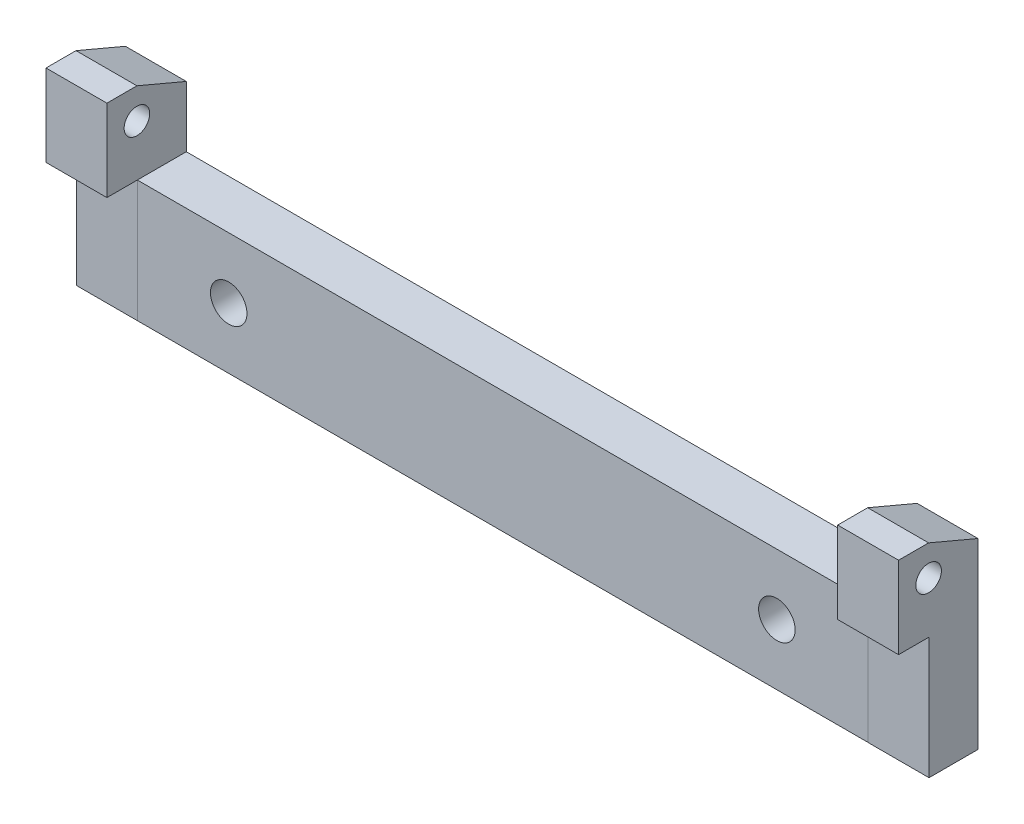
ISO-10303-21;
HEADER;
FILE_DESCRIPTION(('STEP AP214'),'2;1');
FILE_NAME('part.step','',(''),(''),'','','');
FILE_SCHEMA(('AUTOMOTIVE_DESIGN { 1 0 10303 214 1 1 1 1 }'));
ENDSEC;
DATA;
#1=APPLICATION_CONTEXT('core data for automotive mechanical design processes');
#2=APPLICATION_PROTOCOL_DEFINITION('international standard','automotive_design',2000,#1);
#3=PRODUCT_CONTEXT('',#1,'mechanical');
#4=PRODUCT('Part','Part','',(#3));
#5=PRODUCT_RELATED_PRODUCT_CATEGORY('part','',(#4));
#6=PRODUCT_DEFINITION_FORMATION('','',#4);
#7=PRODUCT_DEFINITION_CONTEXT('part definition',#1,'design');
#8=PRODUCT_DEFINITION('design','',#6,#7);
#9=PRODUCT_DEFINITION_SHAPE('','',#8);
#10=(LENGTH_UNIT() NAMED_UNIT(*) SI_UNIT(.MILLI.,.METRE.));
#11=(NAMED_UNIT(*) PLANE_ANGLE_UNIT() SI_UNIT($,.RADIAN.));
#12=(NAMED_UNIT(*) SI_UNIT($,.STERADIAN.) SOLID_ANGLE_UNIT());
#13=UNCERTAINTY_MEASURE_WITH_UNIT(LENGTH_MEASURE(1.E-05),#10,'distance_accuracy_value','');
#14=(GEOMETRIC_REPRESENTATION_CONTEXT(3) GLOBAL_UNCERTAINTY_ASSIGNED_CONTEXT((#13)) GLOBAL_UNIT_ASSIGNED_CONTEXT((#10,
#11,#12)) REPRESENTATION_CONTEXT('',''));
#15=CARTESIAN_POINT('',(0.,0.,0.));
#16=DIRECTION('',(0.,0.,1.));
#17=DIRECTION('',(1.,0.,0.));
#18=AXIS2_PLACEMENT_3D('',#15,#16,#17);
#19=CARTESIAN_POINT('',(120.,0.,0.));
#20=DIRECTION('',(-1.,0.,0.));
#21=DIRECTION('',(0.,0.,1.));
#22=AXIS2_PLACEMENT_3D('',#19,#20,#21);
#23=PLANE('',#22);
#24=CARTESIAN_POINT('',(120.,8.43400289856773,-27.8888815226087));
#25=DIRECTION('',(1.,0.,0.));
#26=DIRECTION('',(0.,0.,-1.));
#27=AXIS2_PLACEMENT_3D('',#24,#25,#26);
#28=CIRCLE('',#27,2.1);
#29=CARTESIAN_POINT('',(120.,8.43400289856773,-29.9888815226087));
#30=VERTEX_POINT('',#29);
#31=EDGE_CURVE('E186',#30,#30,#28,.T.);
#32=ORIENTED_EDGE('',*,*,#31,.T.);
#33=EDGE_LOOP('',(#32));
#34=FACE_BOUND('',#33,.T.);
#35=DIRECTION('',(0.,1.,0.));
#36=VECTOR('',#35,1.);
#37=CARTESIAN_POINT('',(120.,10.,-36.));
#38=LINE('',#37,#36);
#39=CARTESIAN_POINT('',(120.,0.,-36.));
#40=VERTEX_POINT('',#39);
#41=CARTESIAN_POINT('',(120.,10.,-36.));
#42=VERTEX_POINT('',#41);
#43=EDGE_CURVE('E54',#40,#42,#38,.T.);
#44=ORIENTED_EDGE('',*,*,#43,.F.);
#45=DIRECTION('',(0.,0.,1.));
#46=VECTOR('',#45,1.);
#47=CARTESIAN_POINT('',(120.,0.,-36.));
#48=LINE('',#47,#46);
#49=CARTESIAN_POINT('',(120.,0.,-27.9757067141904));
#50=VERTEX_POINT('',#49);
#51=EDGE_CURVE('E166',#40,#50,#48,.T.);
#52=ORIENTED_EDGE('',*,*,#51,.T.);
#53=DIRECTION('',(0.,1.,0.));
#54=VECTOR('',#53,1.);
#55=CARTESIAN_POINT('',(120.,-20.,-27.9757067141904));
#56=LINE('',#55,#54);
#57=CARTESIAN_POINT('',(120.,-20.,-27.9757067141904));
#58=VERTEX_POINT('',#57);
#59=EDGE_CURVE('E48',#58,#50,#56,.T.);
#60=ORIENTED_EDGE('',*,*,#59,.F.);
#61=DIRECTION('',(0.,0.,-1.));
#62=VECTOR('',#61,1.);
#63=CARTESIAN_POINT('',(120.,-20.,-36.));
#64=LINE('',#63,#62);
#65=CARTESIAN_POINT('',(120.,-20.,-27.9582577076685));
#66=VERTEX_POINT('',#65);
#67=EDGE_CURVE('E196',#66,#58,#64,.T.);
#68=ORIENTED_EDGE('',*,*,#67,.F.);
#69=DIRECTION('',(0.,-1.,0.));
#70=VECTOR('',#69,1.);
#71=CARTESIAN_POINT('',(120.,-20.,-27.9582577076685));
#72=LINE('',#71,#70);
#73=CARTESIAN_POINT('',(120.,0.,-27.9582577076685));
#74=VERTEX_POINT('',#73);
#75=EDGE_CURVE('E218',#74,#66,#72,.T.);
#76=ORIENTED_EDGE('',*,*,#75,.F.);
#77=DIRECTION('',(0.,0.,-1.));
#78=VECTOR('',#77,1.);
#79=CARTESIAN_POINT('',(120.,0.,-27.9582577076685));
#80=LINE('',#79,#78);
#81=CARTESIAN_POINT('',(120.,0.,-22.9582577076685));
#82=VERTEX_POINT('',#81);
#83=EDGE_CURVE('E216',#82,#74,#80,.T.);
#84=ORIENTED_EDGE('',*,*,#83,.F.);
#85=DIRECTION('',(0.,-1.,0.));
#86=VECTOR('',#85,1.);
#87=CARTESIAN_POINT('',(120.,0.,-22.9582577076685));
#88=LINE('',#87,#86);
#89=CARTESIAN_POINT('',(120.,13.4340028985677,-22.9582577076685));
#90=VERTEX_POINT('',#89);
#91=EDGE_CURVE('E214',#90,#82,#88,.T.);
#92=ORIENTED_EDGE('',*,*,#91,.F.);
#93=DIRECTION('',(0.,0.,1.));
#94=VECTOR('',#93,1.);
#95=CARTESIAN_POINT('',(120.,13.4340028985677,-22.9582577076685));
#96=LINE('',#95,#94);
#97=CARTESIAN_POINT('',(120.,13.4340028985677,-27.8888815226087));
#98=VERTEX_POINT('',#97);
#99=EDGE_CURVE('E212',#98,#90,#96,.T.);
#100=ORIENTED_EDGE('',*,*,#99,.F.);
#101=DIRECTION('',(0.,0.389868762606835,0.920870429508634));
#102=VECTOR('',#101,1.);
#103=CARTESIAN_POINT('',(120.,13.4340028985677,-27.8888815226087));
#104=LINE('',#103,#102);
#105=EDGE_CURVE('E210',#42,#98,#104,.T.);
#106=ORIENTED_EDGE('',*,*,#105,.F.);
#107=EDGE_LOOP('',(#44,#52,#60,#68,#76,#84,#92,#100,#106));
#108=FACE_BOUND('',#107,.T.);
#109=ADVANCED_FACE('F33',(#34,#108),#23,.T.);
#110=CARTESIAN_POINT('',(130.,0.,0.));
#111=DIRECTION('',(-1.,0.,0.));
#112=DIRECTION('',(0.,0.,1.));
#113=AXIS2_PLACEMENT_3D('',#110,#111,#112);
#114=PLANE('',#113);
#115=DIRECTION('',(0.,1.,0.));
#116=VECTOR('',#115,1.);
#117=CARTESIAN_POINT('',(130.,10.,-36.));
#118=LINE('',#117,#116);
#119=CARTESIAN_POINT('',(130.,-20.,-36.));
#120=VERTEX_POINT('',#119);
#121=CARTESIAN_POINT('',(130.,10.,-36.));
#122=VERTEX_POINT('',#121);
#123=EDGE_CURVE('E192',#120,#122,#118,.T.);
#124=ORIENTED_EDGE('',*,*,#123,.T.);
#125=DIRECTION('',(0.,0.389868762606835,0.920870429508634));
#126=VECTOR('',#125,1.);
#127=CARTESIAN_POINT('',(130.,13.4340028985677,-27.8888815226087));
#128=LINE('',#127,#126);
#129=CARTESIAN_POINT('',(130.,13.4340028985677,-27.8888815226087));
#130=VERTEX_POINT('',#129);
#131=EDGE_CURVE('E195',#122,#130,#128,.T.);
#132=ORIENTED_EDGE('',*,*,#131,.T.);
#133=DIRECTION('',(0.,0.,1.));
#134=VECTOR('',#133,1.);
#135=CARTESIAN_POINT('',(130.,13.4340028985677,-22.9582577076685));
#136=LINE('',#135,#134);
#137=CARTESIAN_POINT('',(130.,13.4340028985677,-22.9582577076685));
#138=VERTEX_POINT('',#137);
#139=EDGE_CURVE('E198',#130,#138,#136,.T.);
#140=ORIENTED_EDGE('',*,*,#139,.T.);
#141=DIRECTION('',(0.,-1.,0.));
#142=VECTOR('',#141,1.);
#143=CARTESIAN_POINT('',(130.,0.,-22.9582577076685));
#144=LINE('',#143,#142);
#145=CARTESIAN_POINT('',(130.,0.,-22.9582577076685));
#146=VERTEX_POINT('',#145);
#147=EDGE_CURVE('E200',#138,#146,#144,.T.);
#148=ORIENTED_EDGE('',*,*,#147,.T.);
#149=DIRECTION('',(0.,0.,-1.));
#150=VECTOR('',#149,1.);
#151=CARTESIAN_POINT('',(130.,0.,-27.9582577076685));
#152=LINE('',#151,#150);
#153=CARTESIAN_POINT('',(130.,0.,-27.9582577076685));
#154=VERTEX_POINT('',#153);
#155=EDGE_CURVE('E202',#146,#154,#152,.T.);
#156=ORIENTED_EDGE('',*,*,#155,.T.);
#157=DIRECTION('',(0.,-1.,0.));
#158=VECTOR('',#157,1.);
#159=CARTESIAN_POINT('',(130.,-20.,-27.9582577076685));
#160=LINE('',#159,#158);
#161=CARTESIAN_POINT('',(130.,-20.,-27.9582577076685));
#162=VERTEX_POINT('',#161);
#163=EDGE_CURVE('E204',#154,#162,#160,.T.);
#164=ORIENTED_EDGE('',*,*,#163,.T.);
#165=DIRECTION('',(0.,0.,-1.));
#166=VECTOR('',#165,1.);
#167=CARTESIAN_POINT('',(130.,-20.,-36.));
#168=LINE('',#167,#166);
#169=EDGE_CURVE('E206',#162,#120,#168,.T.);
#170=ORIENTED_EDGE('',*,*,#169,.T.);
#171=EDGE_LOOP('',(#124,#132,#140,#148,#156,#164,#170));
#172=FACE_BOUND('',#171,.T.);
#173=CARTESIAN_POINT('',(130.,8.43400289856773,-27.8888815226087));
#174=DIRECTION('',(1.,0.,0.));
#175=DIRECTION('',(0.,0.,-1.));
#176=AXIS2_PLACEMENT_3D('',#173,#174,#175);
#177=CIRCLE('',#176,2.1);
#178=CARTESIAN_POINT('',(130.,8.43400289856773,-29.9888815226087));
#179=VERTEX_POINT('',#178);
#180=EDGE_CURVE('E187',#179,#179,#177,.T.);
#181=ORIENTED_EDGE('',*,*,#180,.F.);
#182=EDGE_LOOP('',(#181));
#183=FACE_BOUND('',#182,.T.);
#184=ADVANCED_FACE('F254',(#172,#183),#114,.F.);
#185=CARTESIAN_POINT('',(130.,10.,-36.));
#186=DIRECTION('',(0.,0.,1.));
#187=DIRECTION('',(0.,-1.,0.));
#188=AXIS2_PLACEMENT_3D('',#185,#186,#187);
#189=PLANE('',#188);
#190=CARTESIAN_POINT('',(14.9988308217961,-9.99999999999999,-36.));
#191=DIRECTION('',(0.,0.,1.));
#192=DIRECTION('',(1.,1.59066796042536E-12,0.));
#193=AXIS2_PLACEMENT_3D('',#190,#191,#192);
#194=ELLIPSE('',#193,3.0000000317154,3.);
#195=CARTESIAN_POINT('',(17.9988308535115,-9.99999999999522,-36.));
#196=VERTEX_POINT('',#195);
#197=EDGE_CURVE('E359',#196,#196,#194,.T.);
#198=ORIENTED_EDGE('',*,*,#197,.T.);
#199=EDGE_LOOP('',(#198));
#200=FACE_BOUND('',#199,.T.);
#201=CARTESIAN_POINT('',(104.998830504642,-9.99999999999999,-36.));
#202=DIRECTION('',(0.,0.,1.));
#203=DIRECTION('',(1.,1.59066796042536E-12,0.));
#204=AXIS2_PLACEMENT_3D('',#201,#202,#203);
#205=ELLIPSE('',#204,3.00000003171541,3.00000000000001);
#206=CARTESIAN_POINT('',(107.998830536358,-9.99999999999522,-36.));
#207=VERTEX_POINT('',#206);
#208=EDGE_CURVE('E362',#207,#207,#205,.T.);
#209=ORIENTED_EDGE('',*,*,#208,.T.);
#210=EDGE_LOOP('',(#209));
#211=FACE_BOUND('',#210,.T.);
#212=DIRECTION('',(-1.,0.,0.));
#213=VECTOR('',#212,1.);
#214=CARTESIAN_POINT('',(130.,-20.,-36.));
#215=LINE('',#214,#213);
#216=CARTESIAN_POINT('',(-10.,-20.,-36.));
#217=VERTEX_POINT('',#216);
#218=EDGE_CURVE('E208',#120,#217,#215,.T.);
#219=ORIENTED_EDGE('',*,*,#218,.T.);
#220=DIRECTION('',(0.,-1.,0.));
#221=VECTOR('',#220,1.);
#222=CARTESIAN_POINT('',(-10.,10.,-36.));
#223=LINE('',#222,#221);
#224=CARTESIAN_POINT('',(-10.,10.,-36.));
#225=VERTEX_POINT('',#224);
#226=EDGE_CURVE('E288',#225,#217,#223,.T.);
#227=ORIENTED_EDGE('',*,*,#226,.F.);
#228=DIRECTION('',(1.,0.,0.));
#229=VECTOR('',#228,1.);
#230=CARTESIAN_POINT('',(-10.,10.,-36.));
#231=LINE('',#230,#229);
#232=CARTESIAN_POINT('',(0.,10.,-36.));
#233=VERTEX_POINT('',#232);
#234=EDGE_CURVE('E170',#225,#233,#231,.T.);
#235=ORIENTED_EDGE('',*,*,#234,.T.);
#236=DIRECTION('',(0.,-1.,0.));
#237=VECTOR('',#236,1.);
#238=CARTESIAN_POINT('',(0.,10.,-36.));
#239=LINE('',#238,#237);
#240=CARTESIAN_POINT('',(0.,0.,-36.));
#241=VERTEX_POINT('',#240);
#242=EDGE_CURVE('E265',#233,#241,#239,.T.);
#243=ORIENTED_EDGE('',*,*,#242,.T.);
#244=DIRECTION('',(1.,0.,0.));
#245=VECTOR('',#244,1.);
#246=CARTESIAN_POINT('',(0.,0.,-36.));
#247=LINE('',#246,#245);
#248=EDGE_CURVE('E176',#241,#40,#247,.T.);
#249=ORIENTED_EDGE('',*,*,#248,.T.);
#250=ORIENTED_EDGE('',*,*,#43,.T.);
#251=DIRECTION('',(-1.,0.,0.));
#252=VECTOR('',#251,1.);
#253=CARTESIAN_POINT('',(130.,10.,-36.));
#254=LINE('',#253,#252);
#255=EDGE_CURVE('E11',#122,#42,#254,.T.);
#256=ORIENTED_EDGE('',*,*,#255,.F.);
#257=ORIENTED_EDGE('',*,*,#123,.F.);
#258=EDGE_LOOP('',(#219,#227,#235,#243,#249,#250,#256,#257));
#259=FACE_BOUND('',#258,.T.);
#260=ADVANCED_FACE('F35',(#200,#211,#259),#189,.F.);
#261=CARTESIAN_POINT('',(130.,13.4340028985677,-27.8888815226087));
#262=DIRECTION('',(0.,-0.920870429508634,0.389868762606835));
#263=DIRECTION('',(0.,-0.389868762606835,-0.920870429508634));
#264=AXIS2_PLACEMENT_3D('',#261,#262,#263);
#265=PLANE('',#264);
#266=ORIENTED_EDGE('',*,*,#105,.T.);
#267=DIRECTION('',(-1.,0.,0.));
#268=VECTOR('',#267,1.);
#269=CARTESIAN_POINT('',(130.,13.4340028985677,-27.8888815226087));
#270=LINE('',#269,#268);
#271=EDGE_CURVE('E41',#130,#98,#270,.T.);
#272=ORIENTED_EDGE('',*,*,#271,.F.);
#273=ORIENTED_EDGE('',*,*,#131,.F.);
#274=ORIENTED_EDGE('',*,*,#255,.T.);
#275=EDGE_LOOP('',(#266,#272,#273,#274));
#276=FACE_BOUND('',#275,.T.);
#277=ADVANCED_FACE('F259',(#276),#265,.F.);
#278=CARTESIAN_POINT('',(130.,13.4340028985677,-22.9582577076685));
#279=DIRECTION('',(0.,-1.,0.));
#280=DIRECTION('',(0.,0.,-1.));
#281=AXIS2_PLACEMENT_3D('',#278,#279,#280);
#282=PLANE('',#281);
#283=ORIENTED_EDGE('',*,*,#99,.T.);
#284=DIRECTION('',(-1.,0.,0.));
#285=VECTOR('',#284,1.);
#286=CARTESIAN_POINT('',(130.,13.4340028985677,-22.9582577076685));
#287=LINE('',#286,#285);
#288=EDGE_CURVE('E231',#138,#90,#287,.T.);
#289=ORIENTED_EDGE('',*,*,#288,.F.);
#290=ORIENTED_EDGE('',*,*,#139,.F.);
#291=ORIENTED_EDGE('',*,*,#271,.T.);
#292=EDGE_LOOP('',(#283,#289,#290,#291));
#293=FACE_BOUND('',#292,.T.);
#294=ADVANCED_FACE('F238',(#293),#282,.F.);
#295=CARTESIAN_POINT('',(130.,0.,-22.9582577076685));
#296=DIRECTION('',(0.,0.,-1.));
#297=DIRECTION('',(-1.,0.,0.));
#298=AXIS2_PLACEMENT_3D('',#295,#296,#297);
#299=PLANE('',#298);
#300=ORIENTED_EDGE('',*,*,#91,.T.);
#301=DIRECTION('',(-1.,0.,0.));
#302=VECTOR('',#301,1.);
#303=CARTESIAN_POINT('',(130.,0.,-22.9582577076685));
#304=LINE('',#303,#302);
#305=EDGE_CURVE('E228',#146,#82,#304,.T.);
#306=ORIENTED_EDGE('',*,*,#305,.F.);
#307=ORIENTED_EDGE('',*,*,#147,.F.);
#308=ORIENTED_EDGE('',*,*,#288,.T.);
#309=EDGE_LOOP('',(#300,#306,#307,#308));
#310=FACE_BOUND('',#309,.T.);
#311=ADVANCED_FACE('F246',(#310),#299,.F.);
#312=CARTESIAN_POINT('',(130.,0.,-27.9582577076685));
#313=DIRECTION('',(0.,1.,0.));
#314=DIRECTION('',(0.,0.,1.));
#315=AXIS2_PLACEMENT_3D('',#312,#313,#314);
#316=PLANE('',#315);
#317=ORIENTED_EDGE('',*,*,#83,.T.);
#318=DIRECTION('',(-1.,0.,0.));
#319=VECTOR('',#318,1.);
#320=CARTESIAN_POINT('',(130.,0.,-27.9582577076685));
#321=LINE('',#320,#319);
#322=EDGE_CURVE('E225',#154,#74,#321,.T.);
#323=ORIENTED_EDGE('',*,*,#322,.F.);
#324=ORIENTED_EDGE('',*,*,#155,.F.);
#325=ORIENTED_EDGE('',*,*,#305,.T.);
#326=EDGE_LOOP('',(#317,#323,#324,#325));
#327=FACE_BOUND('',#326,.T.);
#328=ADVANCED_FACE('F250',(#327),#316,.F.);
#329=CARTESIAN_POINT('',(130.,-20.,-27.9582577076685));
#330=DIRECTION('',(0.,0.,-1.));
#331=DIRECTION('',(-1.,0.,0.));
#332=AXIS2_PLACEMENT_3D('',#329,#330,#331);
#333=PLANE('',#332);
#334=ORIENTED_EDGE('',*,*,#75,.T.);
#335=DIRECTION('',(-1.,0.,0.));
#336=VECTOR('',#335,1.);
#337=CARTESIAN_POINT('',(130.,-20.,-27.9582577076685));
#338=LINE('',#337,#336);
#339=EDGE_CURVE('E222',#162,#66,#338,.T.);
#340=ORIENTED_EDGE('',*,*,#339,.F.);
#341=ORIENTED_EDGE('',*,*,#163,.F.);
#342=ORIENTED_EDGE('',*,*,#322,.T.);
#343=EDGE_LOOP('',(#334,#340,#341,#342));
#344=FACE_BOUND('',#343,.T.);
#345=ADVANCED_FACE('F283',(#344),#333,.F.);
#346=CARTESIAN_POINT('',(130.,-20.,-36.));
#347=DIRECTION('',(0.,1.,0.));
#348=DIRECTION('',(0.,0.,1.));
#349=AXIS2_PLACEMENT_3D('',#346,#347,#348);
#350=PLANE('',#349);
#351=ORIENTED_EDGE('',*,*,#67,.T.);
#352=DIRECTION('',(-0.999999989428201,0.,0.000145408386145217));
#353=VECTOR('',#352,1.);
#354=CARTESIAN_POINT('',(120.,-20.,-27.9757067141904));
#355=LINE('',#354,#353);
#356=CARTESIAN_POINT('',(0.,-20.,-27.9582577076685));
#357=VERTEX_POINT('',#356);
#358=EDGE_CURVE('E174',#58,#357,#355,.T.);
#359=ORIENTED_EDGE('',*,*,#358,.T.);
#360=DIRECTION('',(1.,0.,0.));
#361=VECTOR('',#360,1.);
#362=CARTESIAN_POINT('',(-10.,-20.,-27.9582577076685));
#363=LINE('',#362,#361);
#364=CARTESIAN_POINT('',(-10.,-20.,-27.9582577076685));
#365=VERTEX_POINT('',#364);
#366=EDGE_CURVE('E279',#365,#357,#363,.T.);
#367=ORIENTED_EDGE('',*,*,#366,.F.);
#368=DIRECTION('',(0.,0.,1.));
#369=VECTOR('',#368,1.);
#370=CARTESIAN_POINT('',(-10.,-20.,-36.));
#371=LINE('',#370,#369);
#372=EDGE_CURVE('E285',#217,#365,#371,.T.);
#373=ORIENTED_EDGE('',*,*,#372,.F.);
#374=ORIENTED_EDGE('',*,*,#218,.F.);
#375=ORIENTED_EDGE('',*,*,#169,.F.);
#376=ORIENTED_EDGE('',*,*,#339,.T.);
#377=EDGE_LOOP('',(#351,#359,#367,#373,#374,#375,#376));
#378=FACE_BOUND('',#377,.T.);
#379=ADVANCED_FACE('F277',(#378),#350,.F.);
#380=CARTESIAN_POINT('',(130.,8.43400289856773,-27.8888815226087));
#381=DIRECTION('',(-1.,0.,0.));
#382=DIRECTION('',(0.,0.,1.));
#383=AXIS2_PLACEMENT_3D('',#380,#381,#382);
#384=CYLINDRICAL_SURFACE('',#383,2.1);
#385=ORIENTED_EDGE('',*,*,#180,.T.);
#386=EDGE_LOOP('',(#385));
#387=FACE_BOUND('',#386,.T.);
#388=ORIENTED_EDGE('',*,*,#31,.F.);
#389=EDGE_LOOP('',(#388));
#390=FACE_BOUND('',#389,.T.);
#391=ADVANCED_FACE('F341',(#387,#390),#384,.F.);
#392=CARTESIAN_POINT('',(120.,-20.,-27.9757067141904));
#393=DIRECTION('',(-0.000145408386145217,0.,-0.999999989428201));
#394=DIRECTION('',(-0.999999989428201,0.,0.000145408386145217));
#395=AXIS2_PLACEMENT_3D('',#392,#393,#394);
#396=PLANE('',#395);
#397=CARTESIAN_POINT('',(14.999999841423,-9.99999999999999,-27.9604388334607));
#398=DIRECTION('',(0.000145408386145217,0.,0.999999989428201));
#399=DIRECTION('',(0.999999989428201,0.,-0.000145408386145217));
#400=AXIS2_PLACEMENT_3D('',#397,#398,#399);
#401=CIRCLE('',#400,3.);
#402=CARTESIAN_POINT('',(17.9999998097076,-9.99999999999999,-27.9608750586191));
#403=VERTEX_POINT('',#402);
#404=EDGE_CURVE('E364',#403,#403,#401,.T.);
#405=ORIENTED_EDGE('',*,*,#404,.F.);
#406=EDGE_LOOP('',(#405));
#407=FACE_BOUND('',#406,.T.);
#408=CARTESIAN_POINT('',(104.999997621345,-9.99999999999999,-27.9735255880293));
#409=DIRECTION('',(0.000145408386145217,0.,0.999999989428201));
#410=DIRECTION('',(0.999999989428201,0.,-0.000145408386145217));
#411=AXIS2_PLACEMENT_3D('',#408,#409,#410);
#412=CIRCLE('',#411,3.00000000000001);
#413=CARTESIAN_POINT('',(107.99999758963,-9.99999999999999,-27.9739618131877));
#414=VERTEX_POINT('',#413);
#415=EDGE_CURVE('E369',#414,#414,#412,.T.);
#416=ORIENTED_EDGE('',*,*,#415,.F.);
#417=EDGE_LOOP('',(#416));
#418=FACE_BOUND('',#417,.T.);
#419=DIRECTION('',(-0.999999989428201,0.,0.000145408386145217));
#420=VECTOR('',#419,1.);
#421=CARTESIAN_POINT('',(120.,0.,-27.9757067141904));
#422=LINE('',#421,#420);
#423=CARTESIAN_POINT('',(0.,0.,-27.9582577076685));
#424=VERTEX_POINT('',#423);
#425=EDGE_CURVE('E168',#50,#424,#422,.T.);
#426=ORIENTED_EDGE('',*,*,#425,.T.);
#427=DIRECTION('',(0.,1.,0.));
#428=VECTOR('',#427,1.);
#429=CARTESIAN_POINT('',(0.,-20.,-27.9582577076685));
#430=LINE('',#429,#428);
#431=EDGE_CURVE('E175',#357,#424,#430,.T.);
#432=ORIENTED_EDGE('',*,*,#431,.F.);
#433=ORIENTED_EDGE('',*,*,#358,.F.);
#434=ORIENTED_EDGE('',*,*,#59,.T.);
#435=EDGE_LOOP('',(#426,#432,#433,#434));
#436=FACE_BOUND('',#435,.T.);
#437=ADVANCED_FACE('F273',(#407,#418,#436),#396,.F.);
#438=CARTESIAN_POINT('',(0.,0.,0.));
#439=DIRECTION('',(0.,1.,0.));
#440=DIRECTION('',(0.,0.,1.));
#441=AXIS2_PLACEMENT_3D('',#438,#439,#440);
#442=PLANE('',#441);
#443=ORIENTED_EDGE('',*,*,#51,.F.);
#444=ORIENTED_EDGE('',*,*,#248,.F.);
#445=DIRECTION('',(0.,0.,-1.));
#446=VECTOR('',#445,1.);
#447=CARTESIAN_POINT('',(0.,0.,-27.9582577076685));
#448=LINE('',#447,#446);
#449=EDGE_CURVE('E179',#424,#241,#448,.T.);
#450=ORIENTED_EDGE('',*,*,#449,.F.);
#451=ORIENTED_EDGE('',*,*,#425,.F.);
#452=EDGE_LOOP('',(#443,#444,#450,#451));
#453=FACE_BOUND('',#452,.T.);
#454=ADVANCED_FACE('F269',(#453),#442,.T.);
#455=CARTESIAN_POINT('',(0.,0.,0.));
#456=DIRECTION('',(-1.,0.,0.));
#457=DIRECTION('',(0.,0.,1.));
#458=AXIS2_PLACEMENT_3D('',#455,#456,#457);
#459=PLANE('',#458);
#460=CARTESIAN_POINT('',(0.,8.43400289856773,-27.8888815226087));
#461=DIRECTION('',(-1.,0.,0.));
#462=DIRECTION('',(0.,0.,1.));
#463=AXIS2_PLACEMENT_3D('',#460,#461,#462);
#464=CIRCLE('',#463,2.1);
#465=CARTESIAN_POINT('',(0.,8.43400289856773,-25.7888815226087));
#466=VERTEX_POINT('',#465);
#467=EDGE_CURVE('E366',#466,#466,#464,.T.);
#468=ORIENTED_EDGE('',*,*,#467,.T.);
#469=EDGE_LOOP('',(#468));
#470=FACE_BOUND('',#469,.T.);
#471=DIRECTION('',(0.,0.,1.));
#472=VECTOR('',#471,1.);
#473=CARTESIAN_POINT('',(0.,0.,-27.9582577076685));
#474=LINE('',#473,#472);
#475=CARTESIAN_POINT('',(0.,0.,-22.9582577076685));
#476=VERTEX_POINT('',#475);
#477=EDGE_CURVE('E161',#424,#476,#474,.T.);
#478=ORIENTED_EDGE('',*,*,#477,.F.);
#479=ORIENTED_EDGE('',*,*,#449,.T.);
#480=ORIENTED_EDGE('',*,*,#242,.F.);
#481=DIRECTION('',(0.,-0.389868762606835,-0.920870429508634));
#482=VECTOR('',#481,1.);
#483=CARTESIAN_POINT('',(0.,13.4340028985677,-27.8888815226087));
#484=LINE('',#483,#482);
#485=CARTESIAN_POINT('',(0.,13.4340028985677,-27.8888815226087));
#486=VERTEX_POINT('',#485);
#487=EDGE_CURVE('E302',#486,#233,#484,.T.);
#488=ORIENTED_EDGE('',*,*,#487,.F.);
#489=DIRECTION('',(0.,0.,-1.));
#490=VECTOR('',#489,1.);
#491=CARTESIAN_POINT('',(0.,13.4340028985677,-22.9582577076685));
#492=LINE('',#491,#490);
#493=CARTESIAN_POINT('',(0.,13.4340028985677,-22.9582577076685));
#494=VERTEX_POINT('',#493);
#495=EDGE_CURVE('E299',#494,#486,#492,.T.);
#496=ORIENTED_EDGE('',*,*,#495,.F.);
#497=DIRECTION('',(0.,1.,0.));
#498=VECTOR('',#497,1.);
#499=CARTESIAN_POINT('',(0.,0.,-22.9582577076685));
#500=LINE('',#499,#498);
#501=EDGE_CURVE('E165',#476,#494,#500,.T.);
#502=ORIENTED_EDGE('',*,*,#501,.F.);
#503=EDGE_LOOP('',(#478,#479,#480,#488,#496,#502));
#504=FACE_BOUND('',#503,.T.);
#505=ADVANCED_FACE('F314',(#470,#504),#459,.F.);
#506=CARTESIAN_POINT('',(-10.,0.,0.));
#507=DIRECTION('',(-1.,0.,0.));
#508=DIRECTION('',(0.,0.,1.));
#509=AXIS2_PLACEMENT_3D('',#506,#507,#508);
#510=PLANE('',#509);
#511=DIRECTION('',(0.,1.,0.));
#512=VECTOR('',#511,1.);
#513=CARTESIAN_POINT('',(-10.,0.,-22.9582577076685));
#514=LINE('',#513,#512);
#515=CARTESIAN_POINT('',(-10.,0.,-22.9582577076685));
#516=VERTEX_POINT('',#515);
#517=CARTESIAN_POINT('',(-10.,13.4340028985677,-22.9582577076685));
#518=VERTEX_POINT('',#517);
#519=EDGE_CURVE('E151',#516,#518,#514,.T.);
#520=ORIENTED_EDGE('',*,*,#519,.T.);
#521=DIRECTION('',(0.,0.,-1.));
#522=VECTOR('',#521,1.);
#523=CARTESIAN_POINT('',(-10.,13.4340028985677,-22.9582577076685));
#524=LINE('',#523,#522);
#525=CARTESIAN_POINT('',(-10.,13.4340028985677,-27.8888815226087));
#526=VERTEX_POINT('',#525);
#527=EDGE_CURVE('E140',#518,#526,#524,.T.);
#528=ORIENTED_EDGE('',*,*,#527,.T.);
#529=DIRECTION('',(0.,-0.389868762606835,-0.920870429508634));
#530=VECTOR('',#529,1.);
#531=CARTESIAN_POINT('',(-10.,13.4340028985677,-27.8888815226087));
#532=LINE('',#531,#530);
#533=EDGE_CURVE('E150',#526,#225,#532,.T.);
#534=ORIENTED_EDGE('',*,*,#533,.T.);
#535=ORIENTED_EDGE('',*,*,#226,.T.);
#536=ORIENTED_EDGE('',*,*,#372,.T.);
#537=DIRECTION('',(0.,1.,0.));
#538=VECTOR('',#537,1.);
#539=CARTESIAN_POINT('',(-10.,-20.,-27.9582577076685));
#540=LINE('',#539,#538);
#541=CARTESIAN_POINT('',(-10.,0.,-27.9582577076685));
#542=VERTEX_POINT('',#541);
#543=EDGE_CURVE('E291',#365,#542,#540,.T.);
#544=ORIENTED_EDGE('',*,*,#543,.T.);
#545=DIRECTION('',(0.,0.,1.));
#546=VECTOR('',#545,1.);
#547=CARTESIAN_POINT('',(-10.,0.,-27.9582577076685));
#548=LINE('',#547,#546);
#549=EDGE_CURVE('E157',#542,#516,#548,.T.);
#550=ORIENTED_EDGE('',*,*,#549,.T.);
#551=EDGE_LOOP('',(#520,#528,#534,#535,#536,#544,#550));
#552=FACE_BOUND('',#551,.T.);
#553=CARTESIAN_POINT('',(-10.,8.43400289856773,-27.8888815226087));
#554=DIRECTION('',(-1.,0.,0.));
#555=DIRECTION('',(0.,0.,1.));
#556=AXIS2_PLACEMENT_3D('',#553,#554,#555);
#557=CIRCLE('',#556,2.1);
#558=CARTESIAN_POINT('',(-10.,8.43400289856773,-25.7888815226087));
#559=VERTEX_POINT('',#558);
#560=EDGE_CURVE('E300',#559,#559,#557,.T.);
#561=ORIENTED_EDGE('',*,*,#560,.F.);
#562=EDGE_LOOP('',(#561));
#563=FACE_BOUND('',#562,.T.);
#564=ADVANCED_FACE('F154',(#552,#563),#510,.T.);
#565=CARTESIAN_POINT('',(-10.,0.,-22.9582577076685));
#566=DIRECTION('',(0.,0.,-1.));
#567=DIRECTION('',(-1.,0.,0.));
#568=AXIS2_PLACEMENT_3D('',#565,#566,#567);
#569=PLANE('',#568);
#570=ORIENTED_EDGE('',*,*,#501,.T.);
#571=DIRECTION('',(1.,0.,0.));
#572=VECTOR('',#571,1.);
#573=CARTESIAN_POINT('',(-10.,13.4340028985677,-22.9582577076685));
#574=LINE('',#573,#572);
#575=EDGE_CURVE('E144',#518,#494,#574,.T.);
#576=ORIENTED_EDGE('',*,*,#575,.F.);
#577=ORIENTED_EDGE('',*,*,#519,.F.);
#578=DIRECTION('',(1.,0.,0.));
#579=VECTOR('',#578,1.);
#580=CARTESIAN_POINT('',(-10.,0.,-22.9582577076685));
#581=LINE('',#580,#579);
#582=EDGE_CURVE('E297',#516,#476,#581,.T.);
#583=ORIENTED_EDGE('',*,*,#582,.T.);
#584=EDGE_LOOP('',(#570,#576,#577,#583));
#585=FACE_BOUND('',#584,.T.);
#586=ADVANCED_FACE('F163',(#585),#569,.F.);
#587=CARTESIAN_POINT('',(-10.,13.4340028985677,-22.9582577076685));
#588=DIRECTION('',(0.,-1.,0.));
#589=DIRECTION('',(0.,0.,-1.));
#590=AXIS2_PLACEMENT_3D('',#587,#588,#589);
#591=PLANE('',#590);
#592=ORIENTED_EDGE('',*,*,#495,.T.);
#593=DIRECTION('',(1.,0.,0.));
#594=VECTOR('',#593,1.);
#595=CARTESIAN_POINT('',(-10.,13.4340028985677,-27.8888815226087));
#596=LINE('',#595,#594);
#597=EDGE_CURVE('E147',#526,#486,#596,.T.);
#598=ORIENTED_EDGE('',*,*,#597,.F.);
#599=ORIENTED_EDGE('',*,*,#527,.F.);
#600=ORIENTED_EDGE('',*,*,#575,.T.);
#601=EDGE_LOOP('',(#592,#598,#599,#600));
#602=FACE_BOUND('',#601,.T.);
#603=ADVANCED_FACE('F142',(#602),#591,.F.);
#604=CARTESIAN_POINT('',(-10.,13.4340028985677,-27.8888815226087));
#605=DIRECTION('',(0.,-0.920870429508634,0.389868762606835));
#606=DIRECTION('',(0.,-0.389868762606835,-0.920870429508634));
#607=AXIS2_PLACEMENT_3D('',#604,#605,#606);
#608=PLANE('',#607);
#609=ORIENTED_EDGE('',*,*,#487,.T.);
#610=ORIENTED_EDGE('',*,*,#234,.F.);
#611=ORIENTED_EDGE('',*,*,#533,.F.);
#612=ORIENTED_EDGE('',*,*,#597,.T.);
#613=EDGE_LOOP('',(#609,#610,#611,#612));
#614=FACE_BOUND('',#613,.T.);
#615=ADVANCED_FACE('F321',(#614),#608,.F.);
#616=CARTESIAN_POINT('',(-10.,-20.,-27.9582577076685));
#617=DIRECTION('',(0.,0.,-1.));
#618=DIRECTION('',(-1.,0.,0.));
#619=AXIS2_PLACEMENT_3D('',#616,#617,#618);
#620=PLANE('',#619);
#621=ORIENTED_EDGE('',*,*,#431,.T.);
#622=DIRECTION('',(1.,0.,0.));
#623=VECTOR('',#622,1.);
#624=CARTESIAN_POINT('',(-10.,0.,-27.9582577076685));
#625=LINE('',#624,#623);
#626=EDGE_CURVE('E307',#542,#424,#625,.T.);
#627=ORIENTED_EDGE('',*,*,#626,.F.);
#628=ORIENTED_EDGE('',*,*,#543,.F.);
#629=ORIENTED_EDGE('',*,*,#366,.T.);
#630=EDGE_LOOP('',(#621,#627,#628,#629));
#631=FACE_BOUND('',#630,.T.);
#632=ADVANCED_FACE('F319',(#631),#620,.F.);
#633=CARTESIAN_POINT('',(-10.,0.,-27.9582577076685));
#634=DIRECTION('',(0.,1.,0.));
#635=DIRECTION('',(0.,0.,1.));
#636=AXIS2_PLACEMENT_3D('',#633,#634,#635);
#637=PLANE('',#636);
#638=ORIENTED_EDGE('',*,*,#477,.T.);
#639=ORIENTED_EDGE('',*,*,#582,.F.);
#640=ORIENTED_EDGE('',*,*,#549,.F.);
#641=ORIENTED_EDGE('',*,*,#626,.T.);
#642=EDGE_LOOP('',(#638,#639,#640,#641));
#643=FACE_BOUND('',#642,.T.);
#644=ADVANCED_FACE('F316',(#643),#637,.F.);
#645=CARTESIAN_POINT('',(-10.,8.43400289856773,-27.8888815226087));
#646=DIRECTION('',(1.,0.,0.));
#647=DIRECTION('',(0.,0.,-1.));
#648=AXIS2_PLACEMENT_3D('',#645,#646,#647);
#649=CYLINDRICAL_SURFACE('',#648,2.1);
#650=ORIENTED_EDGE('',*,*,#560,.T.);
#651=EDGE_LOOP('',(#650));
#652=FACE_BOUND('',#651,.T.);
#653=ORIENTED_EDGE('',*,*,#467,.F.);
#654=EDGE_LOOP('',(#653));
#655=FACE_BOUND('',#654,.T.);
#656=ADVANCED_FACE('F327',(#652,#655),#649,.F.);
#657=CARTESIAN_POINT('',(104.997089453622,-9.99999999999999,-47.9735253765933));
#658=DIRECTION('',(0.000145408386145217,0.,0.999999989428201));
#659=DIRECTION('',(0.999999989428201,0.,-0.000145408386145217));
#660=AXIS2_PLACEMENT_3D('',#657,#658,#659);
#661=CYLINDRICAL_SURFACE('',#660,3.00000000000001);
#662=ORIENTED_EDGE('',*,*,#415,.T.);
#663=EDGE_LOOP('',(#662));
#664=FACE_BOUND('',#663,.T.);
#665=ORIENTED_EDGE('',*,*,#208,.F.);
#666=EDGE_LOOP('',(#665));
#667=FACE_BOUND('',#666,.T.);
#668=ADVANCED_FACE('F380',(#664,#667),#661,.F.);
#669=CARTESIAN_POINT('',(14.9970916737001,-9.99999999999999,-47.9604386220247));
#670=DIRECTION('',(0.000145408386145217,0.,0.999999989428201));
#671=DIRECTION('',(0.999999989428201,0.,-0.000145408386145217));
#672=AXIS2_PLACEMENT_3D('',#669,#670,#671);
#673=CYLINDRICAL_SURFACE('',#672,3.);
#674=ORIENTED_EDGE('',*,*,#404,.T.);
#675=EDGE_LOOP('',(#674));
#676=FACE_BOUND('',#675,.T.);
#677=ORIENTED_EDGE('',*,*,#197,.F.);
#678=EDGE_LOOP('',(#677));
#679=FACE_BOUND('',#678,.T.);
#680=ADVANCED_FACE('F386',(#676,#679),#673,.F.);
#681=CLOSED_SHELL('',(#109,#184,#260,#277,#294,#311,#328,#345,#379,#391,#437,#454,#505,#564,
#586,#603,#615,#632,#644,#656,#668,#680));
#682=MANIFOLD_SOLID_BREP('B2',#681);
#683=ADVANCED_BREP_SHAPE_REPRESENTATION('',(#18,#682),#14);
#684=SHAPE_DEFINITION_REPRESENTATION(#9,#683);
ENDSEC;
END-ISO-10303-21;
